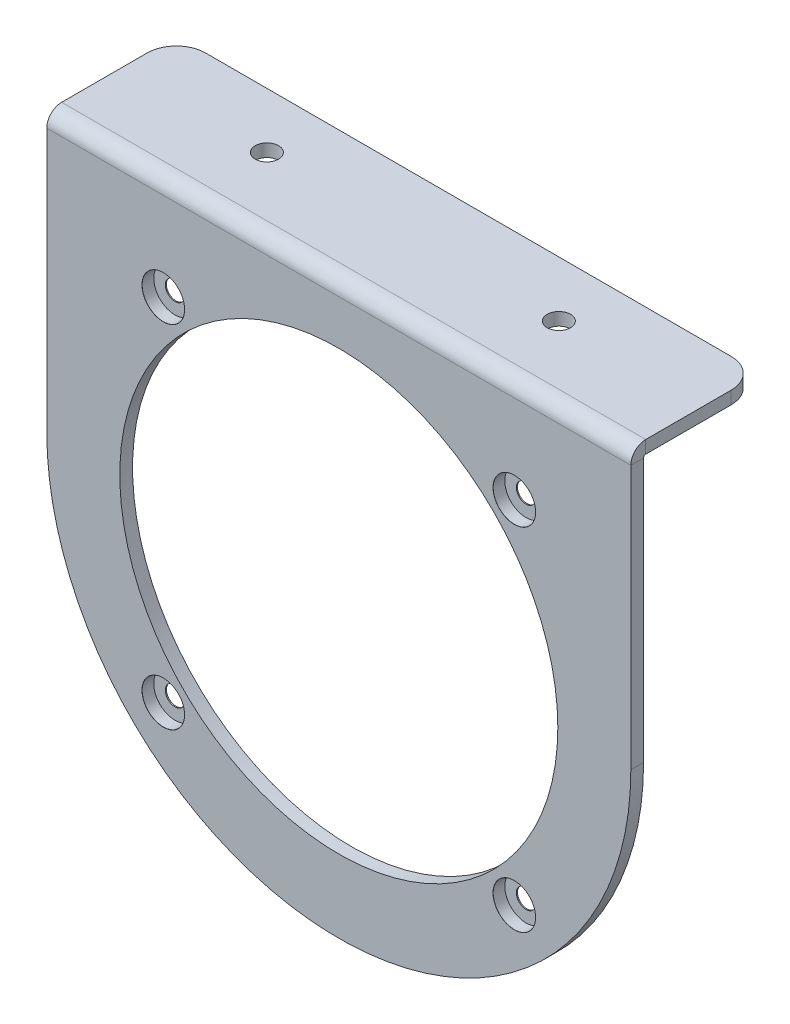
ISO-10303-21;
HEADER;
FILE_DESCRIPTION(('STEP AP214'),'2;1');
FILE_NAME('part.step','',(''),(''),'','','');
FILE_SCHEMA(('AUTOMOTIVE_DESIGN { 1 0 10303 214 1 1 1 1 }'));
ENDSEC;
DATA;
#1=APPLICATION_CONTEXT('core data for automotive mechanical design processes');
#2=APPLICATION_PROTOCOL_DEFINITION('international standard','automotive_design',2000,#1);
#3=PRODUCT_CONTEXT('',#1,'mechanical');
#4=PRODUCT('Part','Part','',(#3));
#5=PRODUCT_RELATED_PRODUCT_CATEGORY('part','',(#4));
#6=PRODUCT_DEFINITION_FORMATION('','',#4);
#7=PRODUCT_DEFINITION_CONTEXT('part definition',#1,'design');
#8=PRODUCT_DEFINITION('design','',#6,#7);
#9=PRODUCT_DEFINITION_SHAPE('','',#8);
#10=(LENGTH_UNIT() NAMED_UNIT(*) SI_UNIT(.MILLI.,.METRE.));
#11=(NAMED_UNIT(*) PLANE_ANGLE_UNIT() SI_UNIT($,.RADIAN.));
#12=(NAMED_UNIT(*) SI_UNIT($,.STERADIAN.) SOLID_ANGLE_UNIT());
#13=UNCERTAINTY_MEASURE_WITH_UNIT(LENGTH_MEASURE(1.E-05),#10,'distance_accuracy_value','');
#14=(GEOMETRIC_REPRESENTATION_CONTEXT(3) GLOBAL_UNCERTAINTY_ASSIGNED_CONTEXT((#13)) GLOBAL_UNIT_ASSIGNED_CONTEXT((#10,
#11,#12)) REPRESENTATION_CONTEXT('',''));
#15=CARTESIAN_POINT('',(0.,0.,0.));
#16=DIRECTION('',(0.,0.,1.));
#17=DIRECTION('',(1.,0.,0.));
#18=AXIS2_PLACEMENT_3D('',#15,#16,#17);
#19=CARTESIAN_POINT('',(100.,95.4,-4.365));
#20=DIRECTION('',(1.,0.,0.));
#21=DIRECTION('',(0.,0.,-1.));
#22=AXIS2_PLACEMENT_3D('',#19,#20,#21);
#23=PLANE('',#22);
#24=DIRECTION('',(0.,1.,0.));
#25=VECTOR('',#24,1.);
#26=CARTESIAN_POINT('',(100.,95.4,-4.365));
#27=LINE('',#26,#25);
#28=CARTESIAN_POINT('',(100.,0.,-4.365));
#29=VERTEX_POINT('',#28);
#30=CARTESIAN_POINT('',(100.,90.2984,-4.365));
#31=VERTEX_POINT('',#30);
#32=EDGE_CURVE('E210',#29,#31,#27,.T.);
#33=ORIENTED_EDGE('',*,*,#32,.T.);
#34=DIRECTION('',(0.,0.,1.));
#35=VECTOR('',#34,1.);
#36=CARTESIAN_POINT('',(100.,90.2984,-4.365));
#37=LINE('',#36,#35);
#38=CARTESIAN_POINT('',(100.,90.2984,0.));
#39=VERTEX_POINT('',#38);
#40=EDGE_CURVE('E195',#31,#39,#37,.T.);
#41=ORIENTED_EDGE('',*,*,#40,.T.);
#42=DIRECTION('',(0.,1.,0.));
#43=VECTOR('',#42,1.);
#44=CARTESIAN_POINT('',(100.,95.4,0.));
#45=LINE('',#44,#43);
#46=CARTESIAN_POINT('',(100.,0.,0.));
#47=VERTEX_POINT('',#46);
#48=EDGE_CURVE('E219',#47,#39,#45,.T.);
#49=ORIENTED_EDGE('',*,*,#48,.F.);
#50=DIRECTION('',(0.,0.,1.));
#51=VECTOR('',#50,1.);
#52=CARTESIAN_POINT('',(100.,0.,-4.365));
#53=LINE('',#52,#51);
#54=EDGE_CURVE('E216',#29,#47,#53,.T.);
#55=ORIENTED_EDGE('',*,*,#54,.F.);
#56=EDGE_LOOP('',(#33,#41,#49,#55));
#57=FACE_BOUND('',#56,.T.);
#58=ADVANCED_FACE('F67',(#57),#23,.T.);
#59=CARTESIAN_POINT('',(0.,0.,-4.365));
#60=DIRECTION('',(0.,0.,1.));
#61=DIRECTION('',(1.,0.,0.));
#62=AXIS2_PLACEMENT_3D('',#59,#60,#61);
#63=PLANE('',#62);
#64=CARTESIAN_POINT('',(60.1040764008556,60.1040764008575,-4.365));
#65=DIRECTION('',(0.,0.,1.));
#66=DIRECTION('',(1.,0.,0.));
#67=AXIS2_PLACEMENT_3D('',#64,#65,#66);
#68=CIRCLE('',#67,3.3);
#69=CARTESIAN_POINT('',(63.4040764008556,60.1040764008575,-4.365));
#70=VERTEX_POINT('',#69);
#71=EDGE_CURVE('E71',#70,#70,#68,.T.);
#72=ORIENTED_EDGE('',*,*,#71,.T.);
#73=EDGE_LOOP('',(#72));
#74=FACE_BOUND('',#73,.T.);
#75=CARTESIAN_POINT('',(60.1040764008569,-60.1040764008562,-4.365));
#76=DIRECTION('',(0.,0.,1.));
#77=DIRECTION('',(1.,0.,0.));
#78=AXIS2_PLACEMENT_3D('',#75,#76,#77);
#79=CIRCLE('',#78,3.3);
#80=CARTESIAN_POINT('',(63.4040764008569,-60.1040764008562,-4.365));
#81=VERTEX_POINT('',#80);
#82=EDGE_CURVE('E256',#81,#81,#79,.T.);
#83=ORIENTED_EDGE('',*,*,#82,.T.);
#84=EDGE_LOOP('',(#83));
#85=FACE_BOUND('',#84,.T.);
#86=CARTESIAN_POINT('',(-60.104076400856,-60.1040764008571,-4.365));
#87=DIRECTION('',(0.,0.,1.));
#88=DIRECTION('',(1.,0.,0.));
#89=AXIS2_PLACEMENT_3D('',#86,#87,#88);
#90=CIRCLE('',#89,3.3);
#91=CARTESIAN_POINT('',(-56.804076400856,-60.1040764008571,-4.365));
#92=VERTEX_POINT('',#91);
#93=EDGE_CURVE('E252',#92,#92,#90,.T.);
#94=ORIENTED_EDGE('',*,*,#93,.T.);
#95=EDGE_LOOP('',(#94));
#96=FACE_BOUND('',#95,.T.);
#97=CARTESIAN_POINT('',(-60.1040764008569,60.1040764008562,-4.365));
#98=DIRECTION('',(0.,0.,1.));
#99=DIRECTION('',(1.,0.,0.));
#100=AXIS2_PLACEMENT_3D('',#97,#98,#99);
#101=CIRCLE('',#100,3.3);
#102=CARTESIAN_POINT('',(-56.8040764008569,60.1040764008562,-4.365));
#103=VERTEX_POINT('',#102);
#104=EDGE_CURVE('E247',#103,#103,#101,.T.);
#105=ORIENTED_EDGE('',*,*,#104,.T.);
#106=EDGE_LOOP('',(#105));
#107=FACE_BOUND('',#106,.T.);
#108=CARTESIAN_POINT('',(0.,0.,-4.365));
#109=DIRECTION('',(0.,0.,1.));
#110=DIRECTION('',(1.,0.,0.));
#111=AXIS2_PLACEMENT_3D('',#108,#109,#110);
#112=CIRCLE('',#111,75.);
#113=CARTESIAN_POINT('',(75.,0.,-4.365));
#114=VERTEX_POINT('',#113);
#115=EDGE_CURVE('E192',#114,#114,#112,.T.);
#116=ORIENTED_EDGE('',*,*,#115,.T.);
#117=EDGE_LOOP('',(#116));
#118=FACE_BOUND('',#117,.T.);
#119=DIRECTION('',(1.,0.,0.));
#120=VECTOR('',#119,1.);
#121=CARTESIAN_POINT('',(100.,90.2984,-4.365));
#122=LINE('',#121,#120);
#123=CARTESIAN_POINT('',(-100.,90.2984,-4.365));
#124=VERTEX_POINT('',#123);
#125=EDGE_CURVE('E199',#31,#124,#122,.F.);
#126=ORIENTED_EDGE('',*,*,#125,.F.);
#127=ORIENTED_EDGE('',*,*,#32,.F.);
#128=CARTESIAN_POINT('',(0.,0.,-4.365));
#129=DIRECTION('',(0.,0.,1.));
#130=DIRECTION('',(1.,0.,0.));
#131=AXIS2_PLACEMENT_3D('',#128,#129,#130);
#132=CIRCLE('',#131,100.);
#133=CARTESIAN_POINT('',(-100.,0.,-4.365));
#134=VERTEX_POINT('',#133);
#135=EDGE_CURVE('E207',#134,#29,#132,.T.);
#136=ORIENTED_EDGE('',*,*,#135,.F.);
#137=DIRECTION('',(0.,-1.,0.));
#138=VECTOR('',#137,1.);
#139=CARTESIAN_POINT('',(-100.,0.,-4.365));
#140=LINE('',#139,#138);
#141=EDGE_CURVE('E214',#124,#134,#140,.T.);
#142=ORIENTED_EDGE('',*,*,#141,.F.);
#143=EDGE_LOOP('',(#126,#127,#136,#142));
#144=FACE_BOUND('',#143,.T.);
#145=ADVANCED_FACE('F301',(#74,#85,#96,#107,#118,#144),#63,.F.);
#146=CARTESIAN_POINT('',(0.,0.,0.));
#147=DIRECTION('',(0.,0.,1.));
#148=DIRECTION('',(1.,0.,0.));
#149=AXIS2_PLACEMENT_3D('',#146,#147,#148);
#150=PLANE('',#149);
#151=CARTESIAN_POINT('',(60.1040764008556,60.1040764008575,0.));
#152=DIRECTION('',(0.,0.,1.));
#153=DIRECTION('',(1.,0.,0.));
#154=AXIS2_PLACEMENT_3D('',#151,#152,#153);
#155=CIRCLE('',#154,7.29850000000001);
#156=CARTESIAN_POINT('',(67.4025764008556,60.1040764008575,0.));
#157=VERTEX_POINT('',#156);
#158=EDGE_CURVE('E475',#157,#157,#155,.T.);
#159=ORIENTED_EDGE('',*,*,#158,.F.);
#160=EDGE_LOOP('',(#159));
#161=FACE_BOUND('',#160,.T.);
#162=CARTESIAN_POINT('',(60.1040764008569,-60.1040764008562,0.));
#163=DIRECTION('',(0.,0.,1.));
#164=DIRECTION('',(1.,0.,0.));
#165=AXIS2_PLACEMENT_3D('',#162,#163,#164);
#166=CIRCLE('',#165,7.29850000000001);
#167=CARTESIAN_POINT('',(67.4025764008569,-60.1040764008562,0.));
#168=VERTEX_POINT('',#167);
#169=EDGE_CURVE('E485',#168,#168,#166,.T.);
#170=ORIENTED_EDGE('',*,*,#169,.F.);
#171=EDGE_LOOP('',(#170));
#172=FACE_BOUND('',#171,.T.);
#173=CARTESIAN_POINT('',(-60.104076400856,-60.1040764008571,0.));
#174=DIRECTION('',(0.,0.,1.));
#175=DIRECTION('',(1.,0.,0.));
#176=AXIS2_PLACEMENT_3D('',#173,#174,#175);
#177=CIRCLE('',#176,7.2985);
#178=CARTESIAN_POINT('',(-52.805576400856,-60.1040764008571,0.));
#179=VERTEX_POINT('',#178);
#180=EDGE_CURVE('E258',#179,#179,#177,.T.);
#181=ORIENTED_EDGE('',*,*,#180,.F.);
#182=EDGE_LOOP('',(#181));
#183=FACE_BOUND('',#182,.T.);
#184=CARTESIAN_POINT('',(-60.1040764008569,60.1040764008562,0.));
#185=DIRECTION('',(0.,0.,1.));
#186=DIRECTION('',(1.,0.,0.));
#187=AXIS2_PLACEMENT_3D('',#184,#185,#186);
#188=CIRCLE('',#187,7.2985);
#189=CARTESIAN_POINT('',(-52.8055764008569,60.1040764008562,0.));
#190=VERTEX_POINT('',#189);
#191=EDGE_CURVE('E254',#190,#190,#188,.T.);
#192=ORIENTED_EDGE('',*,*,#191,.F.);
#193=EDGE_LOOP('',(#192));
#194=FACE_BOUND('',#193,.T.);
#195=CARTESIAN_POINT('',(0.,0.,0.));
#196=DIRECTION('',(0.,0.,1.));
#197=DIRECTION('',(1.,0.,0.));
#198=AXIS2_PLACEMENT_3D('',#195,#196,#197);
#199=CIRCLE('',#198,75.);
#200=CARTESIAN_POINT('',(75.,0.,0.));
#201=VERTEX_POINT('',#200);
#202=EDGE_CURVE('E246',#201,#201,#199,.T.);
#203=ORIENTED_EDGE('',*,*,#202,.F.);
#204=EDGE_LOOP('',(#203));
#205=FACE_BOUND('',#204,.T.);
#206=ORIENTED_EDGE('',*,*,#48,.T.);
#207=DIRECTION('',(1.,0.,0.));
#208=VECTOR('',#207,1.);
#209=CARTESIAN_POINT('',(100.,90.2984,0.));
#210=LINE('',#209,#208);
#211=CARTESIAN_POINT('',(-100.,90.2984,0.));
#212=VERTEX_POINT('',#211);
#213=EDGE_CURVE('E156',#39,#212,#210,.F.);
#214=ORIENTED_EDGE('',*,*,#213,.T.);
#215=DIRECTION('',(0.,-1.,0.));
#216=VECTOR('',#215,1.);
#217=CARTESIAN_POINT('',(-100.,0.,0.));
#218=LINE('',#217,#216);
#219=CARTESIAN_POINT('',(-100.,0.,0.));
#220=VERTEX_POINT('',#219);
#221=EDGE_CURVE('E211',#212,#220,#218,.T.);
#222=ORIENTED_EDGE('',*,*,#221,.T.);
#223=CARTESIAN_POINT('',(0.,0.,0.));
#224=DIRECTION('',(0.,0.,1.));
#225=DIRECTION('',(1.,0.,0.));
#226=AXIS2_PLACEMENT_3D('',#223,#224,#225);
#227=CIRCLE('',#226,100.);
#228=EDGE_CURVE('E205',#220,#47,#227,.T.);
#229=ORIENTED_EDGE('',*,*,#228,.T.);
#230=EDGE_LOOP('',(#206,#214,#222,#229));
#231=FACE_BOUND('',#230,.T.);
#232=ADVANCED_FACE('F330',(#161,#172,#183,#194,#205,#231),#150,.T.);
#233=CARTESIAN_POINT('',(0.,0.,-4.365));
#234=DIRECTION('',(0.,0.,1.));
#235=DIRECTION('',(1.,0.,0.));
#236=AXIS2_PLACEMENT_3D('',#233,#234,#235);
#237=CYLINDRICAL_SURFACE('',#236,100.);
#238=ORIENTED_EDGE('',*,*,#228,.F.);
#239=DIRECTION('',(0.,0.,1.));
#240=VECTOR('',#239,1.);
#241=CARTESIAN_POINT('',(-100.,0.,-4.365));
#242=LINE('',#241,#240);
#243=EDGE_CURVE('E223',#134,#220,#242,.T.);
#244=ORIENTED_EDGE('',*,*,#243,.F.);
#245=ORIENTED_EDGE('',*,*,#135,.T.);
#246=ORIENTED_EDGE('',*,*,#54,.T.);
#247=EDGE_LOOP('',(#238,#244,#245,#246));
#248=FACE_BOUND('',#247,.T.);
#249=ADVANCED_FACE('F337',(#248),#237,.T.);
#250=CARTESIAN_POINT('',(-100.,0.,-4.365));
#251=DIRECTION('',(-1.,0.,0.));
#252=DIRECTION('',(0.,0.,1.));
#253=AXIS2_PLACEMENT_3D('',#250,#251,#252);
#254=PLANE('',#253);
#255=DIRECTION('',(0.,0.,1.));
#256=VECTOR('',#255,1.);
#257=CARTESIAN_POINT('',(-100.,90.2984,-4.365));
#258=LINE('',#257,#256);
#259=EDGE_CURVE('E202',#124,#212,#258,.T.);
#260=ORIENTED_EDGE('',*,*,#259,.F.);
#261=ORIENTED_EDGE('',*,*,#141,.T.);
#262=ORIENTED_EDGE('',*,*,#243,.T.);
#263=ORIENTED_EDGE('',*,*,#221,.F.);
#264=EDGE_LOOP('',(#260,#261,#262,#263));
#265=FACE_BOUND('',#264,.T.);
#266=ADVANCED_FACE('F335',(#265),#254,.T.);
#267=CARTESIAN_POINT('',(-100.,90.2984,-5.1016));
#268=DIRECTION('',(-1.,0.,0.));
#269=DIRECTION('',(0.,0.,1.));
#270=AXIS2_PLACEMENT_3D('',#267,#268,#269);
#271=PLANE('',#270);
#272=DIRECTION('',(0.,-1.,0.));
#273=VECTOR('',#272,1.);
#274=CARTESIAN_POINT('',(-100.,95.4,-5.10159999999998));
#275=LINE('',#274,#273);
#276=CARTESIAN_POINT('',(-100.,91.035,-5.1016));
#277=VERTEX_POINT('',#276);
#278=CARTESIAN_POINT('',(-100.,95.4,-5.10159999999998));
#279=VERTEX_POINT('',#278);
#280=EDGE_CURVE('E189',#277,#279,#275,.F.);
#281=ORIENTED_EDGE('',*,*,#280,.F.);
#282=CARTESIAN_POINT('',(-100.,90.2984,-5.1016));
#283=DIRECTION('',(1.,0.,0.));
#284=DIRECTION('',(0.,0.,-1.));
#285=AXIS2_PLACEMENT_3D('',#282,#283,#284);
#286=CIRCLE('',#285,0.736600000000004);
#287=EDGE_CURVE('E159',#124,#277,#286,.F.);
#288=ORIENTED_EDGE('',*,*,#287,.F.);
#289=ORIENTED_EDGE('',*,*,#259,.T.);
#290=CARTESIAN_POINT('',(-100.,90.2984,-5.1016));
#291=DIRECTION('',(1.,0.,0.));
#292=DIRECTION('',(0.,0.,-1.));
#293=AXIS2_PLACEMENT_3D('',#290,#291,#292);
#294=CIRCLE('',#293,5.1016);
#295=EDGE_CURVE('E194',#212,#279,#294,.F.);
#296=ORIENTED_EDGE('',*,*,#295,.T.);
#297=EDGE_LOOP('',(#281,#288,#289,#296));
#298=FACE_BOUND('',#297,.T.);
#299=ADVANCED_FACE('F341',(#298),#271,.T.);
#300=CARTESIAN_POINT('',(100.,90.2984,-5.1016));
#301=DIRECTION('',(-1.,0.,0.));
#302=DIRECTION('',(0.,0.,1.));
#303=AXIS2_PLACEMENT_3D('',#300,#301,#302);
#304=PLANE('',#303);
#305=CARTESIAN_POINT('',(100.,90.2984,-5.1016));
#306=DIRECTION('',(1.,0.,0.));
#307=DIRECTION('',(0.,0.,-1.));
#308=AXIS2_PLACEMENT_3D('',#305,#306,#307);
#309=CIRCLE('',#308,0.736600000000004);
#310=CARTESIAN_POINT('',(100.,91.035,-5.1016));
#311=VERTEX_POINT('',#310);
#312=EDGE_CURVE('E166',#311,#31,#309,.T.);
#313=ORIENTED_EDGE('',*,*,#312,.F.);
#314=DIRECTION('',(0.,-1.,0.));
#315=VECTOR('',#314,1.);
#316=CARTESIAN_POINT('',(100.,91.035,-5.1016));
#317=LINE('',#316,#315);
#318=CARTESIAN_POINT('',(100.,95.4,-5.10159999999998));
#319=VERTEX_POINT('',#318);
#320=EDGE_CURVE('E163',#311,#319,#317,.F.);
#321=ORIENTED_EDGE('',*,*,#320,.T.);
#322=CARTESIAN_POINT('',(100.,90.2984,-5.1016));
#323=DIRECTION('',(1.,0.,0.));
#324=DIRECTION('',(0.,0.,-1.));
#325=AXIS2_PLACEMENT_3D('',#322,#323,#324);
#326=CIRCLE('',#325,5.1016);
#327=EDGE_CURVE('E149',#319,#39,#326,.T.);
#328=ORIENTED_EDGE('',*,*,#327,.T.);
#329=ORIENTED_EDGE('',*,*,#40,.F.);
#330=EDGE_LOOP('',(#313,#321,#328,#329));
#331=FACE_BOUND('',#330,.T.);
#332=ADVANCED_FACE('F164',(#331),#304,.F.);
#333=CARTESIAN_POINT('',(100.,90.2984,-5.1016));
#334=DIRECTION('',(1.,0.,0.));
#335=DIRECTION('',(0.,1.,0.));
#336=AXIS2_PLACEMENT_3D('',#333,#334,#335);
#337=CYLINDRICAL_SURFACE('',#336,5.1016);
#338=ORIENTED_EDGE('',*,*,#213,.F.);
#339=ORIENTED_EDGE('',*,*,#327,.F.);
#340=DIRECTION('',(1.,0.,0.));
#341=VECTOR('',#340,1.);
#342=CARTESIAN_POINT('',(-100.,95.4,-5.10159999999998));
#343=LINE('',#342,#341);
#344=EDGE_CURVE('E153',#319,#279,#343,.F.);
#345=ORIENTED_EDGE('',*,*,#344,.T.);
#346=ORIENTED_EDGE('',*,*,#295,.F.);
#347=EDGE_LOOP('',(#338,#339,#345,#346));
#348=FACE_BOUND('',#347,.T.);
#349=ADVANCED_FACE('F151',(#348),#337,.T.);
#350=CARTESIAN_POINT('',(100.,90.2984,-5.1016));
#351=DIRECTION('',(1.,0.,0.));
#352=DIRECTION('',(0.,1.,0.));
#353=AXIS2_PLACEMENT_3D('',#350,#351,#352);
#354=CYLINDRICAL_SURFACE('',#353,0.736600000000004);
#355=ORIENTED_EDGE('',*,*,#125,.T.);
#356=ORIENTED_EDGE('',*,*,#287,.T.);
#357=DIRECTION('',(1.,0.,0.));
#358=VECTOR('',#357,1.);
#359=CARTESIAN_POINT('',(-100.,91.035,-5.1016));
#360=LINE('',#359,#358);
#361=EDGE_CURVE('E168',#277,#311,#360,.T.);
#362=ORIENTED_EDGE('',*,*,#361,.T.);
#363=ORIENTED_EDGE('',*,*,#312,.T.);
#364=EDGE_LOOP('',(#355,#356,#362,#363));
#365=FACE_BOUND('',#364,.T.);
#366=ADVANCED_FACE('F356',(#365),#354,.F.);
#367=CARTESIAN_POINT('',(100.,95.4000000000001,-44.365));
#368=DIRECTION('',(-1.,0.,0.));
#369=DIRECTION('',(0.,0.,1.));
#370=AXIS2_PLACEMENT_3D('',#367,#368,#369);
#371=PLANE('',#370);
#372=DIRECTION('',(0.,0.,1.));
#373=VECTOR('',#372,1.);
#374=CARTESIAN_POINT('',(100.,91.0350000000002,-44.365));
#375=LINE('',#374,#373);
#376=CARTESIAN_POINT('',(100.,91.0350000000001,-34.365));
#377=VERTEX_POINT('',#376);
#378=EDGE_CURVE('E174',#311,#377,#375,.F.);
#379=ORIENTED_EDGE('',*,*,#378,.T.);
#380=DIRECTION('',(0.,-1.,0.));
#381=VECTOR('',#380,1.);
#382=CARTESIAN_POINT('',(100.,95.4000000000001,-34.365));
#383=LINE('',#382,#381);
#384=CARTESIAN_POINT('',(100.,95.4000000000001,-34.365));
#385=VERTEX_POINT('',#384);
#386=EDGE_CURVE('E92',#377,#385,#383,.F.);
#387=ORIENTED_EDGE('',*,*,#386,.T.);
#388=DIRECTION('',(0.,0.,-1.));
#389=VECTOR('',#388,1.);
#390=CARTESIAN_POINT('',(100.,95.4,3.46225555260425E-13));
#391=LINE('',#390,#389);
#392=EDGE_CURVE('E171',#319,#385,#391,.T.);
#393=ORIENTED_EDGE('',*,*,#392,.F.);
#394=ORIENTED_EDGE('',*,*,#320,.F.);
#395=EDGE_LOOP('',(#379,#387,#393,#394));
#396=FACE_BOUND('',#395,.T.);
#397=ADVANCED_FACE('F176',(#396),#371,.F.);
#398=CARTESIAN_POINT('',(-100.,95.4,-4.36499999999998));
#399=DIRECTION('',(1.,0.,0.));
#400=DIRECTION('',(0.,0.,-1.));
#401=AXIS2_PLACEMENT_3D('',#398,#399,#400);
#402=PLANE('',#401);
#403=DIRECTION('',(0.,0.,1.));
#404=VECTOR('',#403,1.);
#405=CARTESIAN_POINT('',(-100.,95.4,3.46225555260425E-13));
#406=LINE('',#405,#404);
#407=CARTESIAN_POINT('',(-100.,95.4000000000001,-34.365));
#408=VERTEX_POINT('',#407);
#409=EDGE_CURVE('E173',#408,#279,#406,.T.);
#410=ORIENTED_EDGE('',*,*,#409,.F.);
#411=DIRECTION('',(0.,-1.,0.));
#412=VECTOR('',#411,1.);
#413=CARTESIAN_POINT('',(-100.,95.4000000000001,-34.365));
#414=LINE('',#413,#412);
#415=CARTESIAN_POINT('',(-100.,91.0350000000001,-34.365));
#416=VERTEX_POINT('',#415);
#417=EDGE_CURVE('E13',#408,#416,#414,.T.);
#418=ORIENTED_EDGE('',*,*,#417,.T.);
#419=DIRECTION('',(0.,0.,-1.));
#420=VECTOR('',#419,1.);
#421=CARTESIAN_POINT('',(-100.,91.035,-4.365));
#422=LINE('',#421,#420);
#423=EDGE_CURVE('E178',#416,#277,#422,.F.);
#424=ORIENTED_EDGE('',*,*,#423,.T.);
#425=ORIENTED_EDGE('',*,*,#280,.T.);
#426=EDGE_LOOP('',(#410,#418,#424,#425));
#427=FACE_BOUND('',#426,.T.);
#428=ADVANCED_FACE('F368',(#427),#402,.F.);
#429=CARTESIAN_POINT('',(0.,95.4,3.46225555260425E-13));
#430=DIRECTION('',(0.,-1.,0.));
#431=DIRECTION('',(0.,0.,-1.));
#432=AXIS2_PLACEMENT_3D('',#429,#430,#431);
#433=PLANE('',#432);
#434=CARTESIAN_POINT('',(-50.,95.4000000000001,-25.365));
#435=DIRECTION('',(0.,1.,0.));
#436=DIRECTION('',(0.,0.,1.));
#437=AXIS2_PLACEMENT_3D('',#434,#435,#436);
#438=CIRCLE('',#437,4.);
#439=CARTESIAN_POINT('',(-50.,95.4000000000001,-21.365));
#440=VERTEX_POINT('',#439);
#441=EDGE_CURVE('E243',#440,#440,#438,.T.);
#442=ORIENTED_EDGE('',*,*,#441,.F.);
#443=EDGE_LOOP('',(#442));
#444=FACE_BOUND('',#443,.T.);
#445=CARTESIAN_POINT('',(50.,95.4000000000001,-25.365));
#446=DIRECTION('',(0.,1.,0.));
#447=DIRECTION('',(0.,0.,-1.));
#448=AXIS2_PLACEMENT_3D('',#445,#446,#447);
#449=CIRCLE('',#448,4.);
#450=CARTESIAN_POINT('',(50.,95.4000000000001,-29.365));
#451=VERTEX_POINT('',#450);
#452=EDGE_CURVE('E250',#451,#451,#449,.T.);
#453=ORIENTED_EDGE('',*,*,#452,.F.);
#454=EDGE_LOOP('',(#453));
#455=FACE_BOUND('',#454,.T.);
#456=ORIENTED_EDGE('',*,*,#392,.T.);
#457=CARTESIAN_POINT('',(90.,95.4000000000001,-34.365));
#458=DIRECTION('',(0.,-1.,0.));
#459=DIRECTION('',(0.,0.,-1.));
#460=AXIS2_PLACEMENT_3D('',#457,#458,#459);
#461=CIRCLE('',#460,10.);
#462=CARTESIAN_POINT('',(90.,95.4000000000001,-44.365));
#463=VERTEX_POINT('',#462);
#464=EDGE_CURVE('E76',#385,#463,#461,.F.);
#465=ORIENTED_EDGE('',*,*,#464,.T.);
#466=DIRECTION('',(-1.,0.,0.));
#467=VECTOR('',#466,1.);
#468=CARTESIAN_POINT('',(0.,95.4000000000001,-44.365));
#469=LINE('',#468,#467);
#470=CARTESIAN_POINT('',(-90.,95.4000000000001,-44.365));
#471=VERTEX_POINT('',#470);
#472=EDGE_CURVE('E177',#463,#471,#469,.T.);
#473=ORIENTED_EDGE('',*,*,#472,.T.);
#474=CARTESIAN_POINT('',(-90.,95.4000000000001,-34.365));
#475=DIRECTION('',(0.,-1.,0.));
#476=DIRECTION('',(0.,0.,-1.));
#477=AXIS2_PLACEMENT_3D('',#474,#475,#476);
#478=CIRCLE('',#477,10.);
#479=EDGE_CURVE('E84',#471,#408,#478,.F.);
#480=ORIENTED_EDGE('',*,*,#479,.T.);
#481=ORIENTED_EDGE('',*,*,#409,.T.);
#482=ORIENTED_EDGE('',*,*,#344,.F.);
#483=EDGE_LOOP('',(#456,#465,#473,#480,#481,#482));
#484=FACE_BOUND('',#483,.T.);
#485=ADVANCED_FACE('F170',(#444,#455,#484),#433,.F.);
#486=CARTESIAN_POINT('',(0.,91.035,3.30985239216375E-13));
#487=DIRECTION('',(0.,-1.,0.));
#488=DIRECTION('',(0.,0.,-1.));
#489=AXIS2_PLACEMENT_3D('',#486,#487,#488);
#490=PLANE('',#489);
#491=CARTESIAN_POINT('',(-50.,91.0350000000001,-25.365));
#492=DIRECTION('',(0.,-1.,0.));
#493=DIRECTION('',(0.,0.,-1.));
#494=AXIS2_PLACEMENT_3D('',#491,#492,#493);
#495=CIRCLE('',#494,4.);
#496=CARTESIAN_POINT('',(-50.,91.0350000000001,-29.365));
#497=VERTEX_POINT('',#496);
#498=EDGE_CURVE('E242',#497,#497,#495,.T.);
#499=ORIENTED_EDGE('',*,*,#498,.F.);
#500=EDGE_LOOP('',(#499));
#501=FACE_BOUND('',#500,.T.);
#502=CARTESIAN_POINT('',(50.,91.0350000000001,-25.365));
#503=DIRECTION('',(0.,-1.,0.));
#504=DIRECTION('',(0.,0.,-1.));
#505=AXIS2_PLACEMENT_3D('',#502,#503,#504);
#506=CIRCLE('',#505,4.);
#507=CARTESIAN_POINT('',(50.,91.0350000000001,-29.365));
#508=VERTEX_POINT('',#507);
#509=EDGE_CURVE('E239',#508,#508,#506,.T.);
#510=ORIENTED_EDGE('',*,*,#509,.F.);
#511=EDGE_LOOP('',(#510));
#512=FACE_BOUND('',#511,.T.);
#513=DIRECTION('',(1.,0.,0.));
#514=VECTOR('',#513,1.);
#515=CARTESIAN_POINT('',(-100.,91.0350000000002,-44.365));
#516=LINE('',#515,#514);
#517=CARTESIAN_POINT('',(90.,91.0350000000002,-44.365));
#518=VERTEX_POINT('',#517);
#519=CARTESIAN_POINT('',(-90.,91.0350000000002,-44.365));
#520=VERTEX_POINT('',#519);
#521=EDGE_CURVE('E181',#518,#520,#516,.F.);
#522=ORIENTED_EDGE('',*,*,#521,.F.);
#523=CARTESIAN_POINT('',(90.,91.0350000000001,-34.365));
#524=DIRECTION('',(0.,-1.,0.));
#525=DIRECTION('',(0.,0.,-1.));
#526=AXIS2_PLACEMENT_3D('',#523,#524,#525);
#527=CIRCLE('',#526,10.);
#528=EDGE_CURVE('E234',#518,#377,#527,.T.);
#529=ORIENTED_EDGE('',*,*,#528,.T.);
#530=ORIENTED_EDGE('',*,*,#378,.F.);
#531=ORIENTED_EDGE('',*,*,#361,.F.);
#532=ORIENTED_EDGE('',*,*,#423,.F.);
#533=CARTESIAN_POINT('',(-90.,91.0350000000001,-34.365));
#534=DIRECTION('',(0.,-1.,0.));
#535=DIRECTION('',(0.,0.,-1.));
#536=AXIS2_PLACEMENT_3D('',#533,#534,#535);
#537=CIRCLE('',#536,10.);
#538=EDGE_CURVE('E232',#416,#520,#537,.T.);
#539=ORIENTED_EDGE('',*,*,#538,.T.);
#540=EDGE_LOOP('',(#522,#529,#530,#531,#532,#539));
#541=FACE_BOUND('',#540,.T.);
#542=ADVANCED_FACE('F317',(#501,#512,#541),#490,.T.);
#543=CARTESIAN_POINT('',(-100.,95.4000000000001,-44.365));
#544=DIRECTION('',(0.,0.,1.));
#545=DIRECTION('',(0.,-1.,0.));
#546=AXIS2_PLACEMENT_3D('',#543,#544,#545);
#547=PLANE('',#546);
#548=ORIENTED_EDGE('',*,*,#472,.F.);
#549=DIRECTION('',(0.,-1.,0.));
#550=VECTOR('',#549,1.);
#551=CARTESIAN_POINT('',(90.,95.4000000000001,-44.365));
#552=LINE('',#551,#550);
#553=EDGE_CURVE('E229',#463,#518,#552,.T.);
#554=ORIENTED_EDGE('',*,*,#553,.T.);
#555=ORIENTED_EDGE('',*,*,#521,.T.);
#556=DIRECTION('',(0.,-1.,0.));
#557=VECTOR('',#556,1.);
#558=CARTESIAN_POINT('',(-90.,95.4000000000001,-44.365));
#559=LINE('',#558,#557);
#560=EDGE_CURVE('E226',#520,#471,#559,.F.);
#561=ORIENTED_EDGE('',*,*,#560,.T.);
#562=EDGE_LOOP('',(#548,#554,#555,#561));
#563=FACE_BOUND('',#562,.T.);
#564=ADVANCED_FACE('F307',(#563),#547,.F.);
#565=CARTESIAN_POINT('',(0.,0.,-10.));
#566=DIRECTION('',(0.,0.,1.));
#567=DIRECTION('',(1.,0.,0.));
#568=AXIS2_PLACEMENT_3D('',#565,#566,#567);
#569=CYLINDRICAL_SURFACE('',#568,75.);
#570=ORIENTED_EDGE('',*,*,#202,.T.);
#571=EDGE_LOOP('',(#570));
#572=FACE_BOUND('',#571,.T.);
#573=ORIENTED_EDGE('',*,*,#115,.F.);
#574=EDGE_LOOP('',(#573));
#575=FACE_BOUND('',#574,.T.);
#576=ADVANCED_FACE('F304',(#572,#575),#569,.F.);
#577=CARTESIAN_POINT('',(90.,95.4000000000001,-34.365));
#578=DIRECTION('',(0.,-1.,0.));
#579=DIRECTION('',(0.,0.,-1.));
#580=AXIS2_PLACEMENT_3D('',#577,#578,#579);
#581=CYLINDRICAL_SURFACE('',#580,10.);
#582=ORIENTED_EDGE('',*,*,#464,.F.);
#583=ORIENTED_EDGE('',*,*,#386,.F.);
#584=ORIENTED_EDGE('',*,*,#528,.F.);
#585=ORIENTED_EDGE('',*,*,#553,.F.);
#586=EDGE_LOOP('',(#582,#583,#584,#585));
#587=FACE_BOUND('',#586,.T.);
#588=ADVANCED_FACE('F306',(#587),#581,.T.);
#589=CARTESIAN_POINT('',(-90.,95.4000000000001,-34.365));
#590=DIRECTION('',(0.,-1.,0.));
#591=DIRECTION('',(0.,0.,-1.));
#592=AXIS2_PLACEMENT_3D('',#589,#590,#591);
#593=CYLINDRICAL_SURFACE('',#592,10.);
#594=ORIENTED_EDGE('',*,*,#479,.F.);
#595=ORIENTED_EDGE('',*,*,#560,.F.);
#596=ORIENTED_EDGE('',*,*,#538,.F.);
#597=ORIENTED_EDGE('',*,*,#417,.F.);
#598=EDGE_LOOP('',(#594,#595,#596,#597));
#599=FACE_BOUND('',#598,.T.);
#600=ADVANCED_FACE('F69',(#599),#593,.T.);
#601=CARTESIAN_POINT('',(50.,85.4000000000001,-25.365));
#602=DIRECTION('',(0.,1.,0.));
#603=DIRECTION('',(0.,0.,1.));
#604=AXIS2_PLACEMENT_3D('',#601,#602,#603);
#605=CYLINDRICAL_SURFACE('',#604,4.);
#606=ORIENTED_EDGE('',*,*,#509,.T.);
#607=EDGE_LOOP('',(#606));
#608=FACE_BOUND('',#607,.T.);
#609=ORIENTED_EDGE('',*,*,#452,.T.);
#610=EDGE_LOOP('',(#609));
#611=FACE_BOUND('',#610,.T.);
#612=ADVANCED_FACE('F395',(#608,#611),#605,.F.);
#613=CARTESIAN_POINT('',(-50.,85.4000000000001,-25.365));
#614=DIRECTION('',(0.,1.,0.));
#615=DIRECTION('',(0.,0.,1.));
#616=AXIS2_PLACEMENT_3D('',#613,#614,#615);
#617=CYLINDRICAL_SURFACE('',#616,4.);
#618=ORIENTED_EDGE('',*,*,#498,.T.);
#619=EDGE_LOOP('',(#618));
#620=FACE_BOUND('',#619,.T.);
#621=ORIENTED_EDGE('',*,*,#441,.T.);
#622=EDGE_LOOP('',(#621));
#623=FACE_BOUND('',#622,.T.);
#624=ADVANCED_FACE('F397',(#620,#623),#617,.F.);
#625=CARTESIAN_POINT('',(-60.1040764008569,60.1040764008562,0.));
#626=DIRECTION('',(0.,0.,1.));
#627=DIRECTION('',(1.,0.,0.));
#628=AXIS2_PLACEMENT_3D('',#625,#626,#627);
#629=CYLINDRICAL_SURFACE('',#628,3.3);
#630=CARTESIAN_POINT('',(-60.1040764008569,60.1040764008562,-4.));
#631=DIRECTION('',(0.,0.,1.));
#632=DIRECTION('',(1.,0.,0.));
#633=AXIS2_PLACEMENT_3D('',#630,#631,#632);
#634=CIRCLE('',#633,3.3);
#635=CARTESIAN_POINT('',(-56.8040764008569,60.1040764008562,-4.));
#636=VERTEX_POINT('',#635);
#637=EDGE_CURVE('E251',#636,#636,#634,.T.);
#638=ORIENTED_EDGE('',*,*,#637,.T.);
#639=EDGE_LOOP('',(#638));
#640=FACE_BOUND('',#639,.T.);
#641=ORIENTED_EDGE('',*,*,#104,.F.);
#642=EDGE_LOOP('',(#641));
#643=FACE_BOUND('',#642,.T.);
#644=ADVANCED_FACE('F402',(#640,#643),#629,.F.);
#645=CARTESIAN_POINT('',(-52.8305764008569,60.1040764008562,-4.));
#646=DIRECTION('',(0.,0.,-1.));
#647=DIRECTION('',(-1.,0.,0.));
#648=AXIS2_PLACEMENT_3D('',#645,#646,#647);
#649=PLANE('',#648);
#650=ORIENTED_EDGE('',*,*,#637,.F.);
#651=EDGE_LOOP('',(#650));
#652=FACE_BOUND('',#651,.T.);
#653=CARTESIAN_POINT('',(-60.1040764008569,60.1040764008562,-4.));
#654=DIRECTION('',(0.,0.,1.));
#655=DIRECTION('',(1.,0.,0.));
#656=AXIS2_PLACEMENT_3D('',#653,#654,#655);
#657=CIRCLE('',#656,7.27349999999999);
#658=CARTESIAN_POINT('',(-52.8305764008569,60.1040764008562,-4.));
#659=VERTEX_POINT('',#658);
#660=EDGE_CURVE('E287',#659,#659,#657,.T.);
#661=ORIENTED_EDGE('',*,*,#660,.T.);
#662=EDGE_LOOP('',(#661));
#663=FACE_BOUND('',#662,.T.);
#664=ADVANCED_FACE('F408',(#652,#663),#649,.F.);
#665=CARTESIAN_POINT('',(-60.1040764008569,60.1040764008562,0.));
#666=DIRECTION('',(0.,0.,1.));
#667=DIRECTION('',(1.,0.,0.));
#668=AXIS2_PLACEMENT_3D('',#665,#666,#667);
#669=CYLINDRICAL_SURFACE('',#668,7.27349999999999);
#670=ORIENTED_EDGE('',*,*,#660,.F.);
#671=EDGE_LOOP('',(#670));
#672=FACE_BOUND('',#671,.T.);
#673=CARTESIAN_POINT('',(-60.1040764008569,60.1040764008562,-0.0250000000000017));
#674=DIRECTION('',(0.,0.,1.));
#675=DIRECTION('',(1.,0.,0.));
#676=AXIS2_PLACEMENT_3D('',#673,#674,#675);
#677=CIRCLE('',#676,7.27349999999999);
#678=CARTESIAN_POINT('',(-52.8305764008569,60.1040764008562,-0.0250000000000017));
#679=VERTEX_POINT('',#678);
#680=EDGE_CURVE('E284',#679,#679,#677,.T.);
#681=ORIENTED_EDGE('',*,*,#680,.T.);
#682=EDGE_LOOP('',(#681));
#683=FACE_BOUND('',#682,.T.);
#684=ADVANCED_FACE('F412',(#672,#683),#669,.F.);
#685=CARTESIAN_POINT('',(-60.1040764008569,60.1040764008562,0.));
#686=DIRECTION('',(0.,0.,1.));
#687=DIRECTION('',(1.,0.,0.));
#688=AXIS2_PLACEMENT_3D('',#685,#686,#687);
#689=CONICAL_SURFACE('',#688,7.2985,0.785398163397446);
#690=ORIENTED_EDGE('',*,*,#680,.F.);
#691=EDGE_LOOP('',(#690));
#692=FACE_BOUND('',#691,.T.);
#693=ORIENTED_EDGE('',*,*,#191,.T.);
#694=EDGE_LOOP('',(#693));
#695=FACE_BOUND('',#694,.T.);
#696=ADVANCED_FACE('F416',(#692,#695),#689,.F.);
#697=CARTESIAN_POINT('',(-60.104076400856,-60.1040764008571,0.));
#698=DIRECTION('',(0.,0.,1.));
#699=DIRECTION('',(1.,0.,0.));
#700=AXIS2_PLACEMENT_3D('',#697,#698,#699);
#701=CYLINDRICAL_SURFACE('',#700,3.3);
#702=CARTESIAN_POINT('',(-60.104076400856,-60.1040764008571,-4.));
#703=DIRECTION('',(0.,0.,1.));
#704=DIRECTION('',(1.,0.,0.));
#705=AXIS2_PLACEMENT_3D('',#702,#703,#704);
#706=CIRCLE('',#705,3.3);
#707=CARTESIAN_POINT('',(-56.804076400856,-60.1040764008571,-4.));
#708=VERTEX_POINT('',#707);
#709=EDGE_CURVE('E255',#708,#708,#706,.T.);
#710=ORIENTED_EDGE('',*,*,#709,.T.);
#711=EDGE_LOOP('',(#710));
#712=FACE_BOUND('',#711,.T.);
#713=ORIENTED_EDGE('',*,*,#93,.F.);
#714=EDGE_LOOP('',(#713));
#715=FACE_BOUND('',#714,.T.);
#716=ADVANCED_FACE('F420',(#712,#715),#701,.F.);
#717=CARTESIAN_POINT('',(-52.830576400856,-60.1040764008571,-4.));
#718=DIRECTION('',(0.,0.,-1.));
#719=DIRECTION('',(-1.,0.,0.));
#720=AXIS2_PLACEMENT_3D('',#717,#718,#719);
#721=PLANE('',#720);
#722=ORIENTED_EDGE('',*,*,#709,.F.);
#723=EDGE_LOOP('',(#722));
#724=FACE_BOUND('',#723,.T.);
#725=CARTESIAN_POINT('',(-60.104076400856,-60.1040764008571,-4.));
#726=DIRECTION('',(0.,0.,1.));
#727=DIRECTION('',(1.,0.,0.));
#728=AXIS2_PLACEMENT_3D('',#725,#726,#727);
#729=CIRCLE('',#728,7.27349999999999);
#730=CARTESIAN_POINT('',(-52.830576400856,-60.1040764008571,-4.));
#731=VERTEX_POINT('',#730);
#732=EDGE_CURVE('E277',#731,#731,#729,.T.);
#733=ORIENTED_EDGE('',*,*,#732,.T.);
#734=EDGE_LOOP('',(#733));
#735=FACE_BOUND('',#734,.T.);
#736=ADVANCED_FACE('F424',(#724,#735),#721,.F.);
#737=CARTESIAN_POINT('',(-60.104076400856,-60.1040764008571,0.));
#738=DIRECTION('',(0.,0.,1.));
#739=DIRECTION('',(1.,0.,0.));
#740=AXIS2_PLACEMENT_3D('',#737,#738,#739);
#741=CYLINDRICAL_SURFACE('',#740,7.2735);
#742=ORIENTED_EDGE('',*,*,#732,.F.);
#743=EDGE_LOOP('',(#742));
#744=FACE_BOUND('',#743,.T.);
#745=CARTESIAN_POINT('',(-60.104076400856,-60.1040764008571,-0.0250000000000017));
#746=DIRECTION('',(0.,0.,1.));
#747=DIRECTION('',(1.,0.,0.));
#748=AXIS2_PLACEMENT_3D('',#745,#746,#747);
#749=CIRCLE('',#748,7.2735);
#750=CARTESIAN_POINT('',(-52.830576400856,-60.1040764008571,-0.0250000000000017));
#751=VERTEX_POINT('',#750);
#752=EDGE_CURVE('E263',#751,#751,#749,.T.);
#753=ORIENTED_EDGE('',*,*,#752,.T.);
#754=EDGE_LOOP('',(#753));
#755=FACE_BOUND('',#754,.T.);
#756=ADVANCED_FACE('F428',(#744,#755),#741,.F.);
#757=CARTESIAN_POINT('',(-60.104076400856,-60.1040764008571,0.));
#758=DIRECTION('',(0.,0.,1.));
#759=DIRECTION('',(1.,0.,0.));
#760=AXIS2_PLACEMENT_3D('',#757,#758,#759);
#761=CONICAL_SURFACE('',#760,7.2985,0.785398163397308);
#762=ORIENTED_EDGE('',*,*,#752,.F.);
#763=EDGE_LOOP('',(#762));
#764=FACE_BOUND('',#763,.T.);
#765=ORIENTED_EDGE('',*,*,#180,.T.);
#766=EDGE_LOOP('',(#765));
#767=FACE_BOUND('',#766,.T.);
#768=ADVANCED_FACE('F432',(#764,#767),#761,.F.);
#769=CARTESIAN_POINT('',(60.1040764008569,-60.1040764008562,0.));
#770=DIRECTION('',(0.,0.,1.));
#771=DIRECTION('',(1.,0.,0.));
#772=AXIS2_PLACEMENT_3D('',#769,#770,#771);
#773=CYLINDRICAL_SURFACE('',#772,3.3);
#774=CARTESIAN_POINT('',(60.1040764008569,-60.1040764008562,-4.));
#775=DIRECTION('',(0.,0.,1.));
#776=DIRECTION('',(1.,0.,0.));
#777=AXIS2_PLACEMENT_3D('',#774,#775,#776);
#778=CIRCLE('',#777,3.3);
#779=CARTESIAN_POINT('',(63.4040764008569,-60.1040764008562,-4.));
#780=VERTEX_POINT('',#779);
#781=EDGE_CURVE('E259',#780,#780,#778,.T.);
#782=ORIENTED_EDGE('',*,*,#781,.T.);
#783=EDGE_LOOP('',(#782));
#784=FACE_BOUND('',#783,.T.);
#785=ORIENTED_EDGE('',*,*,#82,.F.);
#786=EDGE_LOOP('',(#785));
#787=FACE_BOUND('',#786,.T.);
#788=ADVANCED_FACE('F436',(#784,#787),#773,.F.);
#789=CARTESIAN_POINT('',(67.3775764008569,-60.1040764008562,-4.));
#790=DIRECTION('',(0.,0.,-1.));
#791=DIRECTION('',(-1.,0.,0.));
#792=AXIS2_PLACEMENT_3D('',#789,#790,#791);
#793=PLANE('',#792);
#794=ORIENTED_EDGE('',*,*,#781,.F.);
#795=EDGE_LOOP('',(#794));
#796=FACE_BOUND('',#795,.T.);
#797=CARTESIAN_POINT('',(60.1040764008569,-60.1040764008562,-4.));
#798=DIRECTION('',(0.,0.,1.));
#799=DIRECTION('',(1.,0.,0.));
#800=AXIS2_PLACEMENT_3D('',#797,#798,#799);
#801=CIRCLE('',#800,7.27349999999999);
#802=CARTESIAN_POINT('',(67.3775764008569,-60.1040764008562,-4.));
#803=VERTEX_POINT('',#802);
#804=EDGE_CURVE('E266',#803,#803,#801,.T.);
#805=ORIENTED_EDGE('',*,*,#804,.T.);
#806=EDGE_LOOP('',(#805));
#807=FACE_BOUND('',#806,.T.);
#808=ADVANCED_FACE('F440',(#796,#807),#793,.F.);
#809=CARTESIAN_POINT('',(60.1040764008569,-60.1040764008562,0.));
#810=DIRECTION('',(0.,0.,1.));
#811=DIRECTION('',(1.,0.,0.));
#812=AXIS2_PLACEMENT_3D('',#809,#810,#811);
#813=CYLINDRICAL_SURFACE('',#812,7.27349999999999);
#814=ORIENTED_EDGE('',*,*,#804,.F.);
#815=EDGE_LOOP('',(#814));
#816=FACE_BOUND('',#815,.T.);
#817=CARTESIAN_POINT('',(60.1040764008569,-60.1040764008562,-0.0250000000000017));
#818=DIRECTION('',(0.,0.,1.));
#819=DIRECTION('',(1.,0.,0.));
#820=AXIS2_PLACEMENT_3D('',#817,#818,#819);
#821=CIRCLE('',#820,7.27349999999999);
#822=CARTESIAN_POINT('',(67.3775764008569,-60.1040764008562,-0.0250000000000017));
#823=VERTEX_POINT('',#822);
#824=EDGE_CURVE('E271',#823,#823,#821,.T.);
#825=ORIENTED_EDGE('',*,*,#824,.T.);
#826=EDGE_LOOP('',(#825));
#827=FACE_BOUND('',#826,.T.);
#828=ADVANCED_FACE('F443',(#816,#827),#813,.F.);
#829=CARTESIAN_POINT('',(60.1040764008569,-60.1040764008562,0.));
#830=DIRECTION('',(0.,0.,1.));
#831=DIRECTION('',(1.,0.,0.));
#832=AXIS2_PLACEMENT_3D('',#829,#830,#831);
#833=CONICAL_SURFACE('',#832,7.29850000000001,0.785398163397585);
#834=ORIENTED_EDGE('',*,*,#824,.F.);
#835=EDGE_LOOP('',(#834));
#836=FACE_BOUND('',#835,.T.);
#837=ORIENTED_EDGE('',*,*,#169,.T.);
#838=EDGE_LOOP('',(#837));
#839=FACE_BOUND('',#838,.T.);
#840=ADVANCED_FACE('F447',(#836,#839),#833,.F.);
#841=CARTESIAN_POINT('',(60.1040764008556,60.1040764008575,0.));
#842=DIRECTION('',(0.,0.,1.));
#843=DIRECTION('',(1.,0.,0.));
#844=AXIS2_PLACEMENT_3D('',#841,#842,#843);
#845=CYLINDRICAL_SURFACE('',#844,3.3);
#846=CARTESIAN_POINT('',(60.1040764008556,60.1040764008575,-4.));
#847=DIRECTION('',(0.,0.,1.));
#848=DIRECTION('',(1.,0.,0.));
#849=AXIS2_PLACEMENT_3D('',#846,#847,#848);
#850=CIRCLE('',#849,3.3);
#851=CARTESIAN_POINT('',(63.4040764008556,60.1040764008575,-4.));
#852=VERTEX_POINT('',#851);
#853=EDGE_CURVE('E482',#852,#852,#850,.T.);
#854=ORIENTED_EDGE('',*,*,#853,.T.);
#855=EDGE_LOOP('',(#854));
#856=FACE_BOUND('',#855,.T.);
#857=ORIENTED_EDGE('',*,*,#71,.F.);
#858=EDGE_LOOP('',(#857));
#859=FACE_BOUND('',#858,.T.);
#860=ADVANCED_FACE('F451',(#856,#859),#845,.F.);
#861=CARTESIAN_POINT('',(67.3775764008556,60.1040764008575,-4.));
#862=DIRECTION('',(0.,0.,-1.));
#863=DIRECTION('',(-1.,0.,0.));
#864=AXIS2_PLACEMENT_3D('',#861,#862,#863);
#865=PLANE('',#864);
#866=ORIENTED_EDGE('',*,*,#853,.F.);
#867=EDGE_LOOP('',(#866));
#868=FACE_BOUND('',#867,.T.);
#869=CARTESIAN_POINT('',(60.1040764008556,60.1040764008575,-4.));
#870=DIRECTION('',(0.,0.,1.));
#871=DIRECTION('',(1.,0.,0.));
#872=AXIS2_PLACEMENT_3D('',#869,#870,#871);
#873=CIRCLE('',#872,7.27349999999999);
#874=CARTESIAN_POINT('',(67.3775764008556,60.1040764008575,-4.));
#875=VERTEX_POINT('',#874);
#876=EDGE_CURVE('E477',#875,#875,#873,.T.);
#877=ORIENTED_EDGE('',*,*,#876,.T.);
#878=EDGE_LOOP('',(#877));
#879=FACE_BOUND('',#878,.T.);
#880=ADVANCED_FACE('F455',(#868,#879),#865,.F.);
#881=CARTESIAN_POINT('',(60.1040764008556,60.1040764008575,0.));
#882=DIRECTION('',(0.,0.,1.));
#883=DIRECTION('',(1.,0.,0.));
#884=AXIS2_PLACEMENT_3D('',#881,#882,#883);
#885=CYLINDRICAL_SURFACE('',#884,7.27349999999999);
#886=ORIENTED_EDGE('',*,*,#876,.F.);
#887=EDGE_LOOP('',(#886));
#888=FACE_BOUND('',#887,.T.);
#889=CARTESIAN_POINT('',(60.1040764008556,60.1040764008575,-0.0250000000000017));
#890=DIRECTION('',(0.,0.,1.));
#891=DIRECTION('',(1.,0.,0.));
#892=AXIS2_PLACEMENT_3D('',#889,#890,#891);
#893=CIRCLE('',#892,7.27349999999999);
#894=CARTESIAN_POINT('',(67.3775764008556,60.1040764008575,-0.0250000000000017));
#895=VERTEX_POINT('',#894);
#896=EDGE_CURVE('E472',#895,#895,#893,.T.);
#897=ORIENTED_EDGE('',*,*,#896,.T.);
#898=EDGE_LOOP('',(#897));
#899=FACE_BOUND('',#898,.T.);
#900=ADVANCED_FACE('F459',(#888,#899),#885,.F.);
#901=CARTESIAN_POINT('',(60.1040764008556,60.1040764008575,0.));
#902=DIRECTION('',(0.,0.,1.));
#903=DIRECTION('',(1.,0.,0.));
#904=AXIS2_PLACEMENT_3D('',#901,#902,#903);
#905=CONICAL_SURFACE('',#904,7.29850000000001,0.785398163397585);
#906=ORIENTED_EDGE('',*,*,#896,.F.);
#907=EDGE_LOOP('',(#906));
#908=FACE_BOUND('',#907,.T.);
#909=ORIENTED_EDGE('',*,*,#158,.T.);
#910=EDGE_LOOP('',(#909));
#911=FACE_BOUND('',#910,.T.);
#912=ADVANCED_FACE('F463',(#908,#911),#905,.F.);
#913=CLOSED_SHELL('',(#58,#145,#232,#249,#266,#299,#332,#349,#366,#397,#428,#485,#542,#564,#576,
#588,#600,#612,#624,#644,#664,#684,#696,#716,#736,#756,#768,#788,#808,#828,#840,#860,#880,#900,#912));
#914=MANIFOLD_SOLID_BREP('B2',#913);
#915=ADVANCED_BREP_SHAPE_REPRESENTATION('',(#18,#914),#14);
#916=SHAPE_DEFINITION_REPRESENTATION(#9,#915);
ENDSEC;
END-ISO-10303-21;
